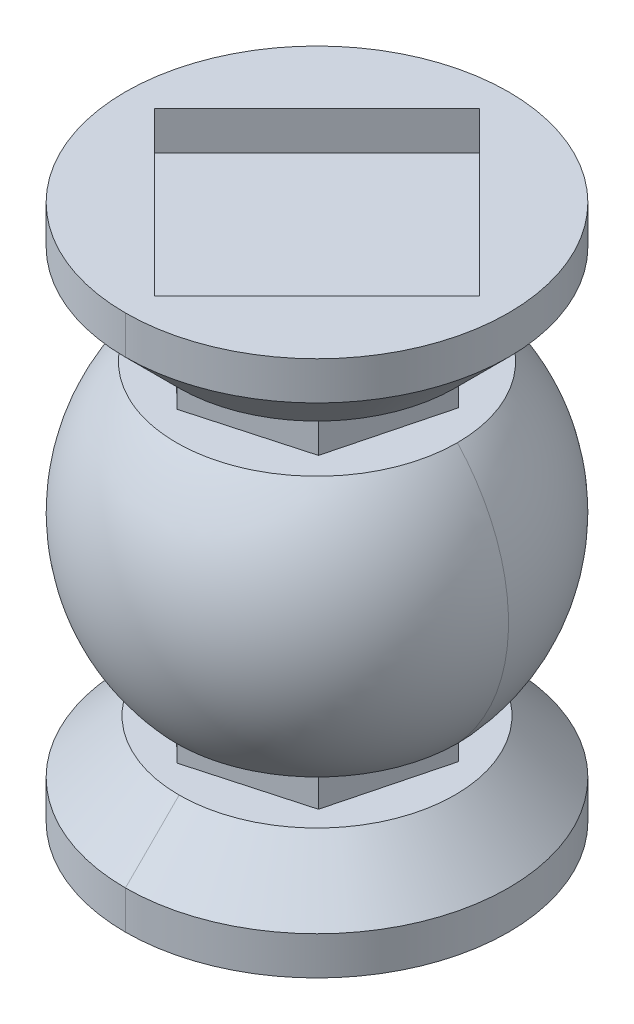
ISO-10303-21;
HEADER;
FILE_DESCRIPTION(('STEP AP214'),'2;1');
FILE_NAME('part.step','',(''),(''),'','','');
FILE_SCHEMA(('AUTOMOTIVE_DESIGN { 1 0 10303 214 1 1 1 1 }'));
ENDSEC;
DATA;
#1=APPLICATION_CONTEXT('core data for automotive mechanical design processes');
#2=APPLICATION_PROTOCOL_DEFINITION('international standard','automotive_design',2000,#1);
#3=PRODUCT_CONTEXT('',#1,'mechanical');
#4=PRODUCT('Part','Part','',(#3));
#5=PRODUCT_RELATED_PRODUCT_CATEGORY('part','',(#4));
#6=PRODUCT_DEFINITION_FORMATION('','',#4);
#7=PRODUCT_DEFINITION_CONTEXT('part definition',#1,'design');
#8=PRODUCT_DEFINITION('design','',#6,#7);
#9=PRODUCT_DEFINITION_SHAPE('','',#8);
#10=(LENGTH_UNIT() NAMED_UNIT(*) SI_UNIT(.MILLI.,.METRE.));
#11=(NAMED_UNIT(*) PLANE_ANGLE_UNIT() SI_UNIT($,.RADIAN.));
#12=(NAMED_UNIT(*) SI_UNIT($,.STERADIAN.) SOLID_ANGLE_UNIT());
#13=UNCERTAINTY_MEASURE_WITH_UNIT(LENGTH_MEASURE(1.E-05),#10,'distance_accuracy_value','');
#14=(GEOMETRIC_REPRESENTATION_CONTEXT(3) GLOBAL_UNCERTAINTY_ASSIGNED_CONTEXT((#13)) GLOBAL_UNIT_ASSIGNED_CONTEXT((#10,
#11,#12)) REPRESENTATION_CONTEXT('',''));
#15=CARTESIAN_POINT('',(0.,0.,0.));
#16=DIRECTION('',(0.,0.,1.));
#17=DIRECTION('',(1.,0.,0.));
#18=AXIS2_PLACEMENT_3D('',#15,#16,#17);
#19=CARTESIAN_POINT('',(0.,-30.,0.));
#20=DIRECTION('',(0.,1.,0.));
#21=DIRECTION('',(1.,0.,0.));
#22=AXIS2_PLACEMENT_3D('',#19,#20,#21);
#23=PLANE('',#22);
#24=DIRECTION('',(0.707106781186548,0.,-0.707106781186548));
#25=VECTOR('',#24,1.);
#26=CARTESIAN_POINT('',(21.2132034355966,-30.,0.));
#27=LINE('',#26,#25);
#28=CARTESIAN_POINT('',(0.,-30.,21.2132034355966));
#29=VERTEX_POINT('',#28);
#30=CARTESIAN_POINT('',(21.2132034355966,-30.,0.));
#31=VERTEX_POINT('',#30);
#32=EDGE_CURVE('E362',#29,#31,#27,.T.);
#33=ORIENTED_EDGE('',*,*,#32,.F.);
#34=DIRECTION('',(0.707106781186547,0.,0.707106781186548));
#35=VECTOR('',#34,1.);
#36=CARTESIAN_POINT('',(-21.2132034355966,-30.,0.));
#37=LINE('',#36,#35);
#38=CARTESIAN_POINT('',(-21.2132034355966,-30.,0.));
#39=VERTEX_POINT('',#38);
#40=EDGE_CURVE('E11',#39,#29,#37,.T.);
#41=ORIENTED_EDGE('',*,*,#40,.F.);
#42=DIRECTION('',(-0.707106781186548,0.,0.707106781186548));
#43=VECTOR('',#42,1.);
#44=CARTESIAN_POINT('',(0.,-30.,-21.2132034355966));
#45=LINE('',#44,#43);
#46=CARTESIAN_POINT('',(0.,-30.,-21.2132034355966));
#47=VERTEX_POINT('',#46);
#48=EDGE_CURVE('E43',#47,#39,#45,.T.);
#49=ORIENTED_EDGE('',*,*,#48,.F.);
#50=DIRECTION('',(-0.707106781186547,0.,-0.707106781186548));
#51=VECTOR('',#50,1.);
#52=CARTESIAN_POINT('',(0.,-30.,-21.2132034355966));
#53=LINE('',#52,#51);
#54=EDGE_CURVE('E378',#31,#47,#53,.T.);
#55=ORIENTED_EDGE('',*,*,#54,.F.);
#56=EDGE_LOOP('',(#33,#41,#49,#55));
#57=FACE_BOUND('',#56,.T.);
#58=ADVANCED_FACE('F16',(#57),#23,.F.);
#59=CARTESIAN_POINT('',(-21.2132034355966,-30.,0.));
#60=DIRECTION('',(0.707106781186548,0.,-0.707106781186547));
#61=DIRECTION('',(0.,-1.,0.));
#62=AXIS2_PLACEMENT_3D('',#59,#60,#61);
#63=PLANE('',#62);
#64=DIRECTION('',(0.707106781186547,0.,0.707106781186548));
#65=VECTOR('',#64,1.);
#66=CARTESIAN_POINT('',(-21.2132034355966,-35.,0.));
#67=LINE('',#66,#65);
#68=CARTESIAN_POINT('',(-21.2132034355966,-35.,0.));
#69=VERTEX_POINT('',#68);
#70=CARTESIAN_POINT('',(0.,-35.,21.2132034355966));
#71=VERTEX_POINT('',#70);
#72=EDGE_CURVE('E416',#69,#71,#67,.T.);
#73=ORIENTED_EDGE('',*,*,#72,.F.);
#74=DIRECTION('',(0.,-1.,0.));
#75=VECTOR('',#74,1.);
#76=CARTESIAN_POINT('',(-21.2132034355966,-30.,0.));
#77=LINE('',#76,#75);
#78=EDGE_CURVE('E24',#39,#69,#77,.T.);
#79=ORIENTED_EDGE('',*,*,#78,.F.);
#80=ORIENTED_EDGE('',*,*,#40,.T.);
#81=DIRECTION('',(0.,-1.,0.));
#82=VECTOR('',#81,1.);
#83=CARTESIAN_POINT('',(0.,-30.,21.2132034355966));
#84=LINE('',#83,#82);
#85=EDGE_CURVE('E330',#29,#71,#84,.T.);
#86=ORIENTED_EDGE('',*,*,#85,.T.);
#87=EDGE_LOOP('',(#73,#79,#80,#86));
#88=FACE_BOUND('',#87,.T.);
#89=ADVANCED_FACE('F637',(#88),#63,.T.);
#90=CARTESIAN_POINT('',(0.,-30.,-21.2132034355966));
#91=DIRECTION('',(0.707106781186548,0.,0.707106781186548));
#92=DIRECTION('',(0.,-1.,0.));
#93=AXIS2_PLACEMENT_3D('',#90,#91,#92);
#94=PLANE('',#93);
#95=DIRECTION('',(-0.707106781186548,0.,0.707106781186548));
#96=VECTOR('',#95,1.);
#97=CARTESIAN_POINT('',(0.,-35.,-21.2132034355966));
#98=LINE('',#97,#96);
#99=CARTESIAN_POINT('',(0.,-35.,-21.2132034355966));
#100=VERTEX_POINT('',#99);
#101=EDGE_CURVE('E501',#100,#69,#98,.T.);
#102=ORIENTED_EDGE('',*,*,#101,.F.);
#103=DIRECTION('',(0.,-1.,0.));
#104=VECTOR('',#103,1.);
#105=CARTESIAN_POINT('',(0.,-30.,-21.2132034355966));
#106=LINE('',#105,#104);
#107=EDGE_CURVE('E373',#47,#100,#106,.T.);
#108=ORIENTED_EDGE('',*,*,#107,.F.);
#109=ORIENTED_EDGE('',*,*,#48,.T.);
#110=ORIENTED_EDGE('',*,*,#78,.T.);
#111=EDGE_LOOP('',(#102,#108,#109,#110));
#112=FACE_BOUND('',#111,.T.);
#113=ADVANCED_FACE('F641',(#112),#94,.T.);
#114=CARTESIAN_POINT('',(0.,-30.,-21.2132034355966));
#115=DIRECTION('',(-0.707106781186548,0.,0.707106781186547));
#116=DIRECTION('',(0.,1.,0.));
#117=AXIS2_PLACEMENT_3D('',#114,#115,#116);
#118=PLANE('',#117);
#119=DIRECTION('',(-0.707106781186547,0.,-0.707106781186548));
#120=VECTOR('',#119,1.);
#121=CARTESIAN_POINT('',(0.,-35.,-21.2132034355966));
#122=LINE('',#121,#120);
#123=CARTESIAN_POINT('',(21.2132034355966,-35.,0.));
#124=VERTEX_POINT('',#123);
#125=EDGE_CURVE('E497',#124,#100,#122,.T.);
#126=ORIENTED_EDGE('',*,*,#125,.F.);
#127=DIRECTION('',(0.,-1.,0.));
#128=VECTOR('',#127,1.);
#129=CARTESIAN_POINT('',(21.2132034355966,-30.,0.));
#130=LINE('',#129,#128);
#131=EDGE_CURVE('E365',#31,#124,#130,.T.);
#132=ORIENTED_EDGE('',*,*,#131,.F.);
#133=ORIENTED_EDGE('',*,*,#54,.T.);
#134=ORIENTED_EDGE('',*,*,#107,.T.);
#135=EDGE_LOOP('',(#126,#132,#133,#134));
#136=FACE_BOUND('',#135,.T.);
#137=ADVANCED_FACE('F649',(#136),#118,.T.);
#138=CARTESIAN_POINT('',(21.2132034355966,-30.,0.));
#139=DIRECTION('',(-0.707106781186548,0.,-0.707106781186548));
#140=DIRECTION('',(-0.707106781186548,0.,0.707106781186548));
#141=AXIS2_PLACEMENT_3D('',#138,#139,#140);
#142=PLANE('',#141);
#143=DIRECTION('',(0.707106781186548,0.,-0.707106781186548));
#144=VECTOR('',#143,1.);
#145=CARTESIAN_POINT('',(21.2132034355966,-35.,0.));
#146=LINE('',#145,#144);
#147=EDGE_CURVE('E420',#71,#124,#146,.T.);
#148=ORIENTED_EDGE('',*,*,#147,.F.);
#149=ORIENTED_EDGE('',*,*,#85,.F.);
#150=ORIENTED_EDGE('',*,*,#32,.T.);
#151=ORIENTED_EDGE('',*,*,#131,.T.);
#152=EDGE_LOOP('',(#148,#149,#150,#151));
#153=FACE_BOUND('',#152,.T.);
#154=ADVANCED_FACE('F644',(#153),#142,.T.);
#155=CARTESIAN_POINT('',(0.,30.,0.));
#156=DIRECTION('',(0.,1.,0.));
#157=DIRECTION('',(1.,0.,0.));
#158=AXIS2_PLACEMENT_3D('',#155,#156,#157);
#159=PLANE('',#158);
#160=DIRECTION('',(0.707106781186548,0.,-0.707106781186548));
#161=VECTOR('',#160,1.);
#162=CARTESIAN_POINT('',(21.2132034355966,30.,0.));
#163=LINE('',#162,#161);
#164=CARTESIAN_POINT('',(0.,30.,21.2132034355966));
#165=VERTEX_POINT('',#164);
#166=CARTESIAN_POINT('',(21.2132034355966,30.,0.));
#167=VERTEX_POINT('',#166);
#168=EDGE_CURVE('E310',#165,#167,#163,.T.);
#169=ORIENTED_EDGE('',*,*,#168,.T.);
#170=DIRECTION('',(-0.707106781186547,0.,-0.707106781186548));
#171=VECTOR('',#170,1.);
#172=CARTESIAN_POINT('',(0.,30.,-21.2132034355966));
#173=LINE('',#172,#171);
#174=CARTESIAN_POINT('',(0.,30.,-21.2132034355966));
#175=VERTEX_POINT('',#174);
#176=EDGE_CURVE('E327',#167,#175,#173,.T.);
#177=ORIENTED_EDGE('',*,*,#176,.T.);
#178=DIRECTION('',(-0.707106781186548,0.,0.707106781186548));
#179=VECTOR('',#178,1.);
#180=CARTESIAN_POINT('',(0.,30.,-21.2132034355966));
#181=LINE('',#180,#179);
#182=CARTESIAN_POINT('',(-21.2132034355966,30.,0.));
#183=VERTEX_POINT('',#182);
#184=EDGE_CURVE('E357',#175,#183,#181,.T.);
#185=ORIENTED_EDGE('',*,*,#184,.T.);
#186=DIRECTION('',(0.707106781186547,0.,0.707106781186548));
#187=VECTOR('',#186,1.);
#188=CARTESIAN_POINT('',(-21.2132034355966,30.,0.));
#189=LINE('',#188,#187);
#190=EDGE_CURVE('E353',#183,#165,#189,.T.);
#191=ORIENTED_EDGE('',*,*,#190,.T.);
#192=EDGE_LOOP('',(#169,#177,#185,#191));
#193=FACE_BOUND('',#192,.T.);
#194=ADVANCED_FACE('F656',(#193),#159,.T.);
#195=CARTESIAN_POINT('',(0.,30.,-21.2132034355966));
#196=DIRECTION('',(0.707106781186548,0.,-0.707106781186547));
#197=DIRECTION('',(0.,-1.,0.));
#198=AXIS2_PLACEMENT_3D('',#195,#196,#197);
#199=PLANE('',#198);
#200=DIRECTION('',(-0.707106781186547,0.,-0.707106781186548));
#201=VECTOR('',#200,1.);
#202=CARTESIAN_POINT('',(0.,35.,-21.2132034355966));
#203=LINE('',#202,#201);
#204=CARTESIAN_POINT('',(21.2132034355966,35.,0.));
#205=VERTEX_POINT('',#204);
#206=CARTESIAN_POINT('',(0.,35.,-21.2132034355966));
#207=VERTEX_POINT('',#206);
#208=EDGE_CURVE('E524',#205,#207,#203,.T.);
#209=ORIENTED_EDGE('',*,*,#208,.T.);
#210=DIRECTION('',(0.,1.,0.));
#211=VECTOR('',#210,1.);
#212=CARTESIAN_POINT('',(0.,30.,-21.2132034355966));
#213=LINE('',#212,#211);
#214=EDGE_CURVE('E331',#175,#207,#213,.T.);
#215=ORIENTED_EDGE('',*,*,#214,.F.);
#216=ORIENTED_EDGE('',*,*,#176,.F.);
#217=DIRECTION('',(0.,1.,0.));
#218=VECTOR('',#217,1.);
#219=CARTESIAN_POINT('',(21.2132034355966,30.,0.));
#220=LINE('',#219,#218);
#221=EDGE_CURVE('E307',#167,#205,#220,.T.);
#222=ORIENTED_EDGE('',*,*,#221,.T.);
#223=EDGE_LOOP('',(#209,#215,#216,#222));
#224=FACE_BOUND('',#223,.T.);
#225=ADVANCED_FACE('F699',(#224),#199,.F.);
#226=CARTESIAN_POINT('',(0.,30.,-21.2132034355966));
#227=DIRECTION('',(-0.707106781186548,0.,-0.707106781186548));
#228=DIRECTION('',(-0.707106781186548,0.,0.707106781186548));
#229=AXIS2_PLACEMENT_3D('',#226,#227,#228);
#230=PLANE('',#229);
#231=DIRECTION('',(-0.707106781186548,0.,0.707106781186548));
#232=VECTOR('',#231,1.);
#233=CARTESIAN_POINT('',(0.,35.,-21.2132034355966));
#234=LINE('',#233,#232);
#235=CARTESIAN_POINT('',(-21.2132034355966,35.,0.));
#236=VERTEX_POINT('',#235);
#237=EDGE_CURVE('E386',#207,#236,#234,.T.);
#238=ORIENTED_EDGE('',*,*,#237,.T.);
#239=DIRECTION('',(0.,1.,0.));
#240=VECTOR('',#239,1.);
#241=CARTESIAN_POINT('',(-21.2132034355966,30.,0.));
#242=LINE('',#241,#240);
#243=EDGE_CURVE('E356',#183,#236,#242,.T.);
#244=ORIENTED_EDGE('',*,*,#243,.F.);
#245=ORIENTED_EDGE('',*,*,#184,.F.);
#246=ORIENTED_EDGE('',*,*,#214,.T.);
#247=EDGE_LOOP('',(#238,#244,#245,#246));
#248=FACE_BOUND('',#247,.T.);
#249=ADVANCED_FACE('F695',(#248),#230,.F.);
#250=CARTESIAN_POINT('',(-21.2132034355966,30.,0.));
#251=DIRECTION('',(-0.707106781186548,0.,0.707106781186547));
#252=DIRECTION('',(0.,1.,0.));
#253=AXIS2_PLACEMENT_3D('',#250,#251,#252);
#254=PLANE('',#253);
#255=DIRECTION('',(0.707106781186547,0.,0.707106781186548));
#256=VECTOR('',#255,1.);
#257=CARTESIAN_POINT('',(-21.2132034355966,35.,0.));
#258=LINE('',#257,#256);
#259=CARTESIAN_POINT('',(0.,35.,21.2132034355966));
#260=VERTEX_POINT('',#259);
#261=EDGE_CURVE('E382',#236,#260,#258,.T.);
#262=ORIENTED_EDGE('',*,*,#261,.T.);
#263=DIRECTION('',(0.,1.,0.));
#264=VECTOR('',#263,1.);
#265=CARTESIAN_POINT('',(0.,30.,21.2132034355966));
#266=LINE('',#265,#264);
#267=EDGE_CURVE('E352',#165,#260,#266,.T.);
#268=ORIENTED_EDGE('',*,*,#267,.F.);
#269=ORIENTED_EDGE('',*,*,#190,.F.);
#270=ORIENTED_EDGE('',*,*,#243,.T.);
#271=EDGE_LOOP('',(#262,#268,#269,#270));
#272=FACE_BOUND('',#271,.T.);
#273=ADVANCED_FACE('F691',(#272),#254,.F.);
#274=CARTESIAN_POINT('',(21.2132034355966,30.,0.));
#275=DIRECTION('',(0.707106781186548,0.,0.707106781186548));
#276=DIRECTION('',(0.,-1.,0.));
#277=AXIS2_PLACEMENT_3D('',#274,#275,#276);
#278=PLANE('',#277);
#279=DIRECTION('',(0.707106781186548,0.,-0.707106781186548));
#280=VECTOR('',#279,1.);
#281=CARTESIAN_POINT('',(21.2132034355966,35.,0.));
#282=LINE('',#281,#280);
#283=EDGE_CURVE('E520',#260,#205,#282,.T.);
#284=ORIENTED_EDGE('',*,*,#283,.T.);
#285=ORIENTED_EDGE('',*,*,#221,.F.);
#286=ORIENTED_EDGE('',*,*,#168,.F.);
#287=ORIENTED_EDGE('',*,*,#267,.T.);
#288=EDGE_LOOP('',(#284,#285,#286,#287));
#289=FACE_BOUND('',#288,.T.);
#290=ADVANCED_FACE('F687',(#289),#278,.F.);
#291=CARTESIAN_POINT('',(0.,-20.,0.));
#292=DIRECTION('',(0.,-1.,0.));
#293=DIRECTION('',(0.,0.,-1.));
#294=AXIS2_PLACEMENT_3D('',#291,#292,#293);
#295=CONICAL_SURFACE('',#294,15.,0.785515656036115);
#296=DIRECTION('',(0.,-0.707023696464563,0.707189856147262));
#297=VECTOR('',#296,1.);
#298=CARTESIAN_POINT('',(0.,-20.,15.));
#299=LINE('',#298,#297);
#300=CARTESIAN_POINT('',(0.,-23.,18.0007050386721));
#301=VERTEX_POINT('',#300);
#302=CARTESIAN_POINT('',(0.,-30.,25.0023501289071));
#303=VERTEX_POINT('',#302);
#304=EDGE_CURVE('E415',#301,#303,#299,.T.);
#305=ORIENTED_EDGE('',*,*,#304,.F.);
#306=CARTESIAN_POINT('',(0.,-23.,0.));
#307=DIRECTION('',(0.,-1.,0.));
#308=DIRECTION('',(0.,0.,1.));
#309=AXIS2_PLACEMENT_3D('',#306,#307,#308);
#310=CIRCLE('',#309,18.0007050386721);
#311=CARTESIAN_POINT('',(0.,-23.,-18.0007050386721));
#312=VERTEX_POINT('',#311);
#313=EDGE_CURVE('E298',#301,#312,#310,.T.);
#314=ORIENTED_EDGE('',*,*,#313,.T.);
#315=DIRECTION('',(0.,-0.707023696464563,-0.707189856147262));
#316=VECTOR('',#315,1.);
#317=CARTESIAN_POINT('',(0.,-20.,-15.));
#318=LINE('',#317,#316);
#319=CARTESIAN_POINT('',(0.,-30.,-25.0023501289071));
#320=VERTEX_POINT('',#319);
#321=EDGE_CURVE('E414',#312,#320,#318,.T.);
#322=ORIENTED_EDGE('',*,*,#321,.T.);
#323=CARTESIAN_POINT('',(0.,-30.,0.));
#324=DIRECTION('',(0.,1.,0.));
#325=DIRECTION('',(0.,0.,1.));
#326=AXIS2_PLACEMENT_3D('',#323,#324,#325);
#327=CIRCLE('',#326,25.0023501289071);
#328=EDGE_CURVE('E311',#320,#303,#327,.T.);
#329=ORIENTED_EDGE('',*,*,#328,.T.);
#330=EDGE_LOOP('',(#305,#314,#322,#329));
#331=FACE_BOUND('',#330,.T.);
#332=ADVANCED_FACE('F684',(#331),#295,.T.);
#333=CARTESIAN_POINT('',(0.,67.707423580786,0.));
#334=DIRECTION('',(0.,1.,0.));
#335=DIRECTION('',(0.,0.,1.));
#336=AXIS2_PLACEMENT_3D('',#333,#334,#335);
#337=CYLINDRICAL_SURFACE('',#336,25.0023501289071);
#338=DIRECTION('',(0.,1.,0.));
#339=VECTOR('',#338,1.);
#340=CARTESIAN_POINT('',(0.,67.707423580786,-25.0023501289071));
#341=LINE('',#340,#339);
#342=CARTESIAN_POINT('',(0.,-35.,-25.002350128907));
#343=VERTEX_POINT('',#342);
#344=EDGE_CURVE('E431',#343,#320,#341,.T.);
#345=ORIENTED_EDGE('',*,*,#344,.F.);
#346=CARTESIAN_POINT('',(0.,-35.,0.));
#347=DIRECTION('',(0.,1.,0.));
#348=DIRECTION('',(0.,0.,1.));
#349=AXIS2_PLACEMENT_3D('',#346,#347,#348);
#350=CIRCLE('',#349,25.002350128907);
#351=CARTESIAN_POINT('',(0.,-35.,25.002350128907));
#352=VERTEX_POINT('',#351);
#353=EDGE_CURVE('E421',#343,#352,#350,.T.);
#354=ORIENTED_EDGE('',*,*,#353,.T.);
#355=DIRECTION('',(0.,1.,0.));
#356=VECTOR('',#355,1.);
#357=CARTESIAN_POINT('',(0.,67.707423580786,25.0023501289071));
#358=LINE('',#357,#356);
#359=EDGE_CURVE('E435',#352,#303,#358,.T.);
#360=ORIENTED_EDGE('',*,*,#359,.T.);
#361=ORIENTED_EDGE('',*,*,#328,.F.);
#362=EDGE_LOOP('',(#345,#354,#360,#361));
#363=FACE_BOUND('',#362,.T.);
#364=ADVANCED_FACE('F683',(#363),#337,.T.);
#365=CARTESIAN_POINT('',(10.7017224091414,-23.,10.5106202232637));
#366=DIRECTION('',(0.968218238813169,0.,0.250106861220409));
#367=DIRECTION('',(0.,-1.,0.));
#368=AXIS2_PLACEMENT_3D('',#365,#366,#367);
#369=PLANE('',#368);
#370=DIRECTION('',(0.250106861220409,0.,-0.968218238813169));
#371=VECTOR('',#370,1.);
#372=CARTESIAN_POINT('',(10.7017224091414,-17.,10.5106202232637));
#373=LINE('',#372,#371);
#374=CARTESIAN_POINT('',(10.7017224091414,-17.,10.5106202232637));
#375=VERTEX_POINT('',#374);
#376=CARTESIAN_POINT('',(14.4533253274476,-17.,-4.01265335893382));
#377=VERTEX_POINT('',#376);
#378=EDGE_CURVE('E319',#375,#377,#373,.T.);
#379=ORIENTED_EDGE('',*,*,#378,.F.);
#380=DIRECTION('',(0.,1.,0.));
#381=VECTOR('',#380,1.);
#382=CARTESIAN_POINT('',(10.7017224091414,-23.,10.5106202232637));
#383=LINE('',#382,#381);
#384=CARTESIAN_POINT('',(10.7017224091414,-23.,10.5106202232637));
#385=VERTEX_POINT('',#384);
#386=EDGE_CURVE('E339',#385,#375,#383,.T.);
#387=ORIENTED_EDGE('',*,*,#386,.F.);
#388=DIRECTION('',(0.250106861220409,0.,-0.968218238813169));
#389=VECTOR('',#388,1.);
#390=CARTESIAN_POINT('',(10.7017224091414,-23.,10.5106202232637));
#391=LINE('',#390,#389);
#392=CARTESIAN_POINT('',(14.4533253274476,-23.,-4.01265335893382));
#393=VERTEX_POINT('',#392);
#394=EDGE_CURVE('E302',#385,#393,#391,.T.);
#395=ORIENTED_EDGE('',*,*,#394,.T.);
#396=DIRECTION('',(0.,1.,0.));
#397=VECTOR('',#396,1.);
#398=CARTESIAN_POINT('',(14.4533253274476,-23.,-4.01265335893382));
#399=LINE('',#398,#397);
#400=EDGE_CURVE('E342',#393,#377,#399,.T.);
#401=ORIENTED_EDGE('',*,*,#400,.T.);
#402=EDGE_LOOP('',(#379,#387,#395,#401));
#403=FACE_BOUND('',#402,.T.);
#404=ADVANCED_FACE('F597',(#403),#369,.T.);
#405=CARTESIAN_POINT('',(14.4533253274476,-23.,-4.01265335893382));
#406=DIRECTION('',(0.700708014884248,0.,-0.713448160609428));
#407=DIRECTION('',(0.,-1.,0.));
#408=AXIS2_PLACEMENT_3D('',#405,#406,#407);
#409=PLANE('',#408);
#410=DIRECTION('',(-0.713448160609428,0.,-0.700708014884248));
#411=VECTOR('',#410,1.);
#412=CARTESIAN_POINT('',(14.4533253274476,-17.,-4.01265335893382));
#413=LINE('',#412,#411);
#414=CARTESIAN_POINT('',(3.75160291830613,-17.,-14.5232735821975));
#415=VERTEX_POINT('',#414);
#416=EDGE_CURVE('E320',#377,#415,#413,.T.);
#417=ORIENTED_EDGE('',*,*,#416,.F.);
#418=ORIENTED_EDGE('',*,*,#400,.F.);
#419=DIRECTION('',(-0.713448160609428,0.,-0.700708014884248));
#420=VECTOR('',#419,1.);
#421=CARTESIAN_POINT('',(14.4533253274476,-23.,-4.01265335893382));
#422=LINE('',#421,#420);
#423=CARTESIAN_POINT('',(3.75160291830613,-23.,-14.5232735821975));
#424=VERTEX_POINT('',#423);
#425=EDGE_CURVE('E285',#393,#424,#422,.T.);
#426=ORIENTED_EDGE('',*,*,#425,.T.);
#427=DIRECTION('',(0.,1.,0.));
#428=VECTOR('',#427,1.);
#429=CARTESIAN_POINT('',(3.75160291830613,-23.,-14.5232735821975));
#430=LINE('',#429,#428);
#431=EDGE_CURVE('E275',#424,#415,#430,.T.);
#432=ORIENTED_EDGE('',*,*,#431,.T.);
#433=EDGE_LOOP('',(#417,#418,#426,#432));
#434=FACE_BOUND('',#433,.T.);
#435=ADVANCED_FACE('F593',(#434),#409,.T.);
#436=CARTESIAN_POINT('',(3.75160291830613,-23.,-14.5232735821975));
#437=DIRECTION('',(-0.267510223928921,0.,-0.963555021829837));
#438=DIRECTION('',(-0.963555021829837,0.,0.267510223928921));
#439=AXIS2_PLACEMENT_3D('',#436,#437,#438);
#440=PLANE('',#439);
#441=DIRECTION('',(-0.963555021829837,0.,0.267510223928921));
#442=VECTOR('',#441,1.);
#443=CARTESIAN_POINT('',(3.75160291830613,-17.,-14.5232735821975));
#444=LINE('',#443,#442);
#445=CARTESIAN_POINT('',(-10.7017224091414,-17.,-10.5106202232637));
#446=VERTEX_POINT('',#445);
#447=EDGE_CURVE('E324',#415,#446,#444,.T.);
#448=ORIENTED_EDGE('',*,*,#447,.F.);
#449=ORIENTED_EDGE('',*,*,#431,.F.);
#450=DIRECTION('',(-0.963555021829837,0.,0.267510223928921));
#451=VECTOR('',#450,1.);
#452=CARTESIAN_POINT('',(3.75160291830613,-23.,-14.5232735821975));
#453=LINE('',#452,#451);
#454=CARTESIAN_POINT('',(-10.7017224091414,-23.,-10.5106202232637));
#455=VERTEX_POINT('',#454);
#456=EDGE_CURVE('E279',#424,#455,#453,.T.);
#457=ORIENTED_EDGE('',*,*,#456,.T.);
#458=DIRECTION('',(0.,1.,0.));
#459=VECTOR('',#458,1.);
#460=CARTESIAN_POINT('',(-10.7017224091414,-23.,-10.5106202232637));
#461=LINE('',#460,#459);
#462=EDGE_CURVE('E263',#455,#446,#461,.T.);
#463=ORIENTED_EDGE('',*,*,#462,.T.);
#464=EDGE_LOOP('',(#448,#449,#457,#463));
#465=FACE_BOUND('',#464,.T.);
#466=ADVANCED_FACE('F280',(#465),#440,.T.);
#467=CARTESIAN_POINT('',(-10.7017224091414,-23.,-10.5106202232637));
#468=DIRECTION('',(-0.968218238813169,0.,-0.250106861220409));
#469=DIRECTION('',(-0.250106861220409,0.,0.968218238813169));
#470=AXIS2_PLACEMENT_3D('',#467,#468,#469);
#471=PLANE('',#470);
#472=DIRECTION('',(-0.250106861220409,0.,0.968218238813169));
#473=VECTOR('',#472,1.);
#474=CARTESIAN_POINT('',(-10.7017224091414,-17.,-10.5106202232637));
#475=LINE('',#474,#473);
#476=CARTESIAN_POINT('',(-14.4533253274476,-17.,4.01265335893382));
#477=VERTEX_POINT('',#476);
#478=EDGE_CURVE('E270',#446,#477,#475,.T.);
#479=ORIENTED_EDGE('',*,*,#478,.F.);
#480=ORIENTED_EDGE('',*,*,#462,.F.);
#481=DIRECTION('',(-0.250106861220409,0.,0.968218238813169));
#482=VECTOR('',#481,1.);
#483=CARTESIAN_POINT('',(-10.7017224091414,-23.,-10.5106202232637));
#484=LINE('',#483,#482);
#485=CARTESIAN_POINT('',(-14.4533253274476,-23.,4.01265335893382));
#486=VERTEX_POINT('',#485);
#487=EDGE_CURVE('E267',#455,#486,#484,.T.);
#488=ORIENTED_EDGE('',*,*,#487,.T.);
#489=DIRECTION('',(0.,1.,0.));
#490=VECTOR('',#489,1.);
#491=CARTESIAN_POINT('',(-14.4533253274476,-23.,4.01265335893382));
#492=LINE('',#491,#490);
#493=EDGE_CURVE('E276',#486,#477,#492,.T.);
#494=ORIENTED_EDGE('',*,*,#493,.T.);
#495=EDGE_LOOP('',(#479,#480,#488,#494));
#496=FACE_BOUND('',#495,.T.);
#497=ADVANCED_FACE('F265',(#496),#471,.T.);
#498=CARTESIAN_POINT('',(-14.4533253274476,-23.,4.01265335893382));
#499=DIRECTION('',(-0.700708014884248,0.,0.713448160609428));
#500=DIRECTION('',(0.,1.,0.));
#501=AXIS2_PLACEMENT_3D('',#498,#499,#500);
#502=PLANE('',#501);
#503=DIRECTION('',(0.713448160609428,0.,0.700708014884248));
#504=VECTOR('',#503,1.);
#505=CARTESIAN_POINT('',(-14.4533253274476,-17.,4.01265335893382));
#506=LINE('',#505,#504);
#507=CARTESIAN_POINT('',(-3.75160291830614,-17.,14.5232735821975));
#508=VERTEX_POINT('',#507);
#509=EDGE_CURVE('E332',#477,#508,#506,.T.);
#510=ORIENTED_EDGE('',*,*,#509,.F.);
#511=ORIENTED_EDGE('',*,*,#493,.F.);
#512=DIRECTION('',(0.713448160609428,0.,0.700708014884248));
#513=VECTOR('',#512,1.);
#514=CARTESIAN_POINT('',(-14.4533253274476,-23.,4.01265335893382));
#515=LINE('',#514,#513);
#516=CARTESIAN_POINT('',(-3.75160291830614,-23.,14.5232735821975));
#517=VERTEX_POINT('',#516);
#518=EDGE_CURVE('E291',#486,#517,#515,.T.);
#519=ORIENTED_EDGE('',*,*,#518,.T.);
#520=DIRECTION('',(0.,1.,0.));
#521=VECTOR('',#520,1.);
#522=CARTESIAN_POINT('',(-3.75160291830614,-23.,14.5232735821975));
#523=LINE('',#522,#521);
#524=EDGE_CURVE('E336',#517,#508,#523,.T.);
#525=ORIENTED_EDGE('',*,*,#524,.T.);
#526=EDGE_LOOP('',(#510,#511,#519,#525));
#527=FACE_BOUND('',#526,.T.);
#528=ADVANCED_FACE('F603',(#527),#502,.T.);
#529=CARTESIAN_POINT('',(-3.75160291830614,-23.,14.5232735821975));
#530=DIRECTION('',(0.267510223928921,0.,0.963555021829837));
#531=DIRECTION('',(0.,-1.,0.));
#532=AXIS2_PLACEMENT_3D('',#529,#530,#531);
#533=PLANE('',#532);
#534=DIRECTION('',(0.963555021829837,0.,-0.267510223928921));
#535=VECTOR('',#534,1.);
#536=CARTESIAN_POINT('',(-3.75160291830614,-17.,14.5232735821975));
#537=LINE('',#536,#535);
#538=EDGE_CURVE('E315',#508,#375,#537,.T.);
#539=ORIENTED_EDGE('',*,*,#538,.F.);
#540=ORIENTED_EDGE('',*,*,#524,.F.);
#541=DIRECTION('',(0.963555021829837,0.,-0.267510223928921));
#542=VECTOR('',#541,1.);
#543=CARTESIAN_POINT('',(-3.75160291830614,-23.,14.5232735821975));
#544=LINE('',#543,#542);
#545=EDGE_CURVE('E306',#517,#385,#544,.T.);
#546=ORIENTED_EDGE('',*,*,#545,.T.);
#547=ORIENTED_EDGE('',*,*,#386,.T.);
#548=EDGE_LOOP('',(#539,#540,#546,#547));
#549=FACE_BOUND('',#548,.T.);
#550=ADVANCED_FACE('F600',(#549),#533,.T.);
#551=CARTESIAN_POINT('',(0.,-17.,0.));
#552=DIRECTION('',(0.,1.,0.));
#553=DIRECTION('',(1.,0.,0.));
#554=AXIS2_PLACEMENT_3D('',#551,#552,#553);
#555=PLANE('',#554);
#556=ORIENTED_EDGE('',*,*,#538,.T.);
#557=ORIENTED_EDGE('',*,*,#378,.T.);
#558=ORIENTED_EDGE('',*,*,#416,.T.);
#559=ORIENTED_EDGE('',*,*,#447,.T.);
#560=ORIENTED_EDGE('',*,*,#478,.T.);
#561=ORIENTED_EDGE('',*,*,#509,.T.);
#562=EDGE_LOOP('',(#556,#557,#558,#559,#560,#561));
#563=FACE_BOUND('',#562,.T.);
#564=CARTESIAN_POINT('',(0.,-17.,0.));
#565=DIRECTION('',(0.,-1.,0.));
#566=DIRECTION('',(0.,0.,1.));
#567=AXIS2_PLACEMENT_3D('',#564,#565,#566);
#568=CIRCLE('',#567,18.3303027798234);
#569=CARTESIAN_POINT('',(-18.3303027798234,-17.,0.));
#570=VERTEX_POINT('',#569);
#571=CARTESIAN_POINT('',(18.3303027798234,-17.,0.));
#572=VERTEX_POINT('',#571);
#573=EDGE_CURVE('E506',#570,#572,#568,.T.);
#574=ORIENTED_EDGE('',*,*,#573,.T.);
#575=CARTESIAN_POINT('',(0.,-17.,0.));
#576=DIRECTION('',(0.,-1.,0.));
#577=DIRECTION('',(0.,0.,1.));
#578=AXIS2_PLACEMENT_3D('',#575,#576,#577);
#579=CIRCLE('',#578,18.3303027798234);
#580=EDGE_CURVE('E470',#572,#570,#579,.T.);
#581=ORIENTED_EDGE('',*,*,#580,.T.);
#582=EDGE_LOOP('',(#574,#581));
#583=FACE_BOUND('',#582,.T.);
#584=ADVANCED_FACE('F605',(#563,#583),#555,.F.);
#585=CARTESIAN_POINT('',(0.,-23.,0.));
#586=DIRECTION('',(0.,1.,0.));
#587=DIRECTION('',(1.,0.,0.));
#588=AXIS2_PLACEMENT_3D('',#585,#586,#587);
#589=PLANE('',#588);
#590=ORIENTED_EDGE('',*,*,#518,.F.);
#591=ORIENTED_EDGE('',*,*,#487,.F.);
#592=ORIENTED_EDGE('',*,*,#456,.F.);
#593=ORIENTED_EDGE('',*,*,#425,.F.);
#594=ORIENTED_EDGE('',*,*,#394,.F.);
#595=ORIENTED_EDGE('',*,*,#545,.F.);
#596=EDGE_LOOP('',(#590,#591,#592,#593,#594,#595));
#597=FACE_BOUND('',#596,.T.);
#598=CARTESIAN_POINT('',(0.,-23.,0.));
#599=DIRECTION('',(0.,-1.,0.));
#600=DIRECTION('',(0.,0.,1.));
#601=AXIS2_PLACEMENT_3D('',#598,#599,#600);
#602=CIRCLE('',#601,18.0007050386721);
#603=EDGE_CURVE('E402',#312,#301,#602,.T.);
#604=ORIENTED_EDGE('',*,*,#603,.F.);
#605=ORIENTED_EDGE('',*,*,#313,.F.);
#606=EDGE_LOOP('',(#604,#605));
#607=FACE_BOUND('',#606,.T.);
#608=ADVANCED_FACE('F287',(#597,#607),#589,.T.);
#609=CARTESIAN_POINT('',(0.,20.,0.));
#610=DIRECTION('',(0.,1.,0.));
#611=DIRECTION('',(0.,0.,1.));
#612=AXIS2_PLACEMENT_3D('',#609,#610,#611);
#613=CONICAL_SURFACE('',#612,15.,0.785515656036115);
#614=DIRECTION('',(0.,0.707023696464563,-0.707189856147262));
#615=VECTOR('',#614,1.);
#616=CARTESIAN_POINT('',(0.,20.,-15.));
#617=LINE('',#616,#615);
#618=CARTESIAN_POINT('',(0.,23.,-18.0007050386721));
#619=VERTEX_POINT('',#618);
#620=CARTESIAN_POINT('',(0.,30.,-25.002350128907));
#621=VERTEX_POINT('',#620);
#622=EDGE_CURVE('E446',#619,#621,#617,.T.);
#623=ORIENTED_EDGE('',*,*,#622,.F.);
#624=CARTESIAN_POINT('',(0.,23.,0.));
#625=DIRECTION('',(0.,1.,0.));
#626=DIRECTION('',(0.,0.,1.));
#627=AXIS2_PLACEMENT_3D('',#624,#625,#626);
#628=CIRCLE('',#627,18.0007050386721);
#629=CARTESIAN_POINT('',(0.,23.,18.0007050386721));
#630=VERTEX_POINT('',#629);
#631=EDGE_CURVE('E515',#619,#630,#628,.T.);
#632=ORIENTED_EDGE('',*,*,#631,.T.);
#633=DIRECTION('',(0.,0.707023696464563,0.707189856147262));
#634=VECTOR('',#633,1.);
#635=CARTESIAN_POINT('',(0.,20.,15.));
#636=LINE('',#635,#634);
#637=CARTESIAN_POINT('',(0.,30.,25.002350128907));
#638=VERTEX_POINT('',#637);
#639=EDGE_CURVE('E409',#630,#638,#636,.T.);
#640=ORIENTED_EDGE('',*,*,#639,.T.);
#641=CARTESIAN_POINT('',(0.,30.,0.));
#642=DIRECTION('',(0.,1.,0.));
#643=DIRECTION('',(0.,0.,1.));
#644=AXIS2_PLACEMENT_3D('',#641,#642,#643);
#645=CIRCLE('',#644,25.002350128907);
#646=EDGE_CURVE('E384',#621,#638,#645,.T.);
#647=ORIENTED_EDGE('',*,*,#646,.F.);
#648=EDGE_LOOP('',(#623,#632,#640,#647));
#649=FACE_BOUND('',#648,.T.);
#650=ADVANCED_FACE('F666',(#649),#613,.T.);
#651=CARTESIAN_POINT('',(0.,67.707423580786,0.));
#652=DIRECTION('',(0.,1.,0.));
#653=DIRECTION('',(0.,0.,1.));
#654=AXIS2_PLACEMENT_3D('',#651,#652,#653);
#655=CYLINDRICAL_SURFACE('',#654,25.002350128907);
#656=DIRECTION('',(0.,1.,0.));
#657=VECTOR('',#656,1.);
#658=CARTESIAN_POINT('',(0.,67.707423580786,-25.002350128907));
#659=LINE('',#658,#657);
#660=CARTESIAN_POINT('',(0.,35.,-25.002350128907));
#661=VERTEX_POINT('',#660);
#662=EDGE_CURVE('E404',#621,#661,#659,.T.);
#663=ORIENTED_EDGE('',*,*,#662,.F.);
#664=ORIENTED_EDGE('',*,*,#646,.T.);
#665=DIRECTION('',(0.,1.,0.));
#666=VECTOR('',#665,1.);
#667=CARTESIAN_POINT('',(0.,67.707423580786,25.002350128907));
#668=LINE('',#667,#666);
#669=CARTESIAN_POINT('',(0.,35.,25.002350128907));
#670=VERTEX_POINT('',#669);
#671=EDGE_CURVE('E475',#638,#670,#668,.T.);
#672=ORIENTED_EDGE('',*,*,#671,.T.);
#673=CARTESIAN_POINT('',(0.,35.,0.));
#674=DIRECTION('',(0.,1.,0.));
#675=DIRECTION('',(0.,0.,1.));
#676=AXIS2_PLACEMENT_3D('',#673,#674,#675);
#677=CIRCLE('',#676,25.002350128907);
#678=EDGE_CURVE('E543',#661,#670,#677,.T.);
#679=ORIENTED_EDGE('',*,*,#678,.F.);
#680=EDGE_LOOP('',(#663,#664,#672,#679));
#681=FACE_BOUND('',#680,.T.);
#682=ADVANCED_FACE('F663',(#681),#655,.T.);
#683=CARTESIAN_POINT('',(0.,35.,0.));
#684=DIRECTION('',(0.,-1.,0.));
#685=DIRECTION('',(0.,0.,-1.));
#686=AXIS2_PLACEMENT_3D('',#683,#684,#685);
#687=PLANE('',#686);
#688=ORIENTED_EDGE('',*,*,#208,.F.);
#689=ORIENTED_EDGE('',*,*,#283,.F.);
#690=ORIENTED_EDGE('',*,*,#261,.F.);
#691=ORIENTED_EDGE('',*,*,#237,.F.);
#692=EDGE_LOOP('',(#688,#689,#690,#691));
#693=FACE_BOUND('',#692,.T.);
#694=CARTESIAN_POINT('',(0.,35.,0.));
#695=DIRECTION('',(0.,1.,0.));
#696=DIRECTION('',(0.,0.,1.));
#697=AXIS2_PLACEMENT_3D('',#694,#695,#696);
#698=CIRCLE('',#697,25.002350128907);
#699=EDGE_CURVE('E408',#670,#661,#698,.T.);
#700=ORIENTED_EDGE('',*,*,#699,.T.);
#701=ORIENTED_EDGE('',*,*,#678,.T.);
#702=EDGE_LOOP('',(#700,#701));
#703=FACE_BOUND('',#702,.T.);
#704=ADVANCED_FACE('F661',(#693,#703),#687,.F.);
#705=CARTESIAN_POINT('',(10.7017224091414,17.,10.5106202232637));
#706=DIRECTION('',(0.968218238813169,0.,0.250106861220409));
#707=DIRECTION('',(0.,-1.,0.));
#708=AXIS2_PLACEMENT_3D('',#705,#706,#707);
#709=PLANE('',#708);
#710=DIRECTION('',(0.250106861220409,0.,-0.968218238813169));
#711=VECTOR('',#710,1.);
#712=CARTESIAN_POINT('',(10.7017224091414,23.,10.5106202232637));
#713=LINE('',#712,#711);
#714=CARTESIAN_POINT('',(10.7017224091414,23.,10.5106202232637));
#715=VERTEX_POINT('',#714);
#716=CARTESIAN_POINT('',(14.4533253274476,23.,-4.01265335893382));
#717=VERTEX_POINT('',#716);
#718=EDGE_CURVE('E464',#715,#717,#713,.T.);
#719=ORIENTED_EDGE('',*,*,#718,.F.);
#720=DIRECTION('',(0.,1.,0.));
#721=VECTOR('',#720,1.);
#722=CARTESIAN_POINT('',(10.7017224091414,17.,10.5106202232637));
#723=LINE('',#722,#721);
#724=CARTESIAN_POINT('',(10.7017224091414,17.,10.5106202232637));
#725=VERTEX_POINT('',#724);
#726=EDGE_CURVE('E573',#725,#715,#723,.T.);
#727=ORIENTED_EDGE('',*,*,#726,.F.);
#728=DIRECTION('',(0.250106861220409,0.,-0.968218238813169));
#729=VECTOR('',#728,1.);
#730=CARTESIAN_POINT('',(10.7017224091414,17.,10.5106202232637));
#731=LINE('',#730,#729);
#732=CARTESIAN_POINT('',(14.4533253274476,17.,-4.01265335893382));
#733=VERTEX_POINT('',#732);
#734=EDGE_CURVE('E558',#725,#733,#731,.T.);
#735=ORIENTED_EDGE('',*,*,#734,.T.);
#736=DIRECTION('',(0.,1.,0.));
#737=VECTOR('',#736,1.);
#738=CARTESIAN_POINT('',(14.4533253274476,17.,-4.01265335893382));
#739=LINE('',#738,#737);
#740=EDGE_CURVE('E540',#733,#717,#739,.T.);
#741=ORIENTED_EDGE('',*,*,#740,.T.);
#742=EDGE_LOOP('',(#719,#727,#735,#741));
#743=FACE_BOUND('',#742,.T.);
#744=ADVANCED_FACE('F724',(#743),#709,.T.);
#745=CARTESIAN_POINT('',(14.4533253274476,17.,-4.01265335893382));
#746=DIRECTION('',(0.700708014884248,0.,-0.713448160609428));
#747=DIRECTION('',(0.,-1.,0.));
#748=AXIS2_PLACEMENT_3D('',#745,#746,#747);
#749=PLANE('',#748);
#750=DIRECTION('',(-0.713448160609428,0.,-0.700708014884248));
#751=VECTOR('',#750,1.);
#752=CARTESIAN_POINT('',(14.4533253274476,23.,-4.01265335893382));
#753=LINE('',#752,#751);
#754=CARTESIAN_POINT('',(3.75160291830613,23.,-14.5232735821975));
#755=VERTEX_POINT('',#754);
#756=EDGE_CURVE('E468',#717,#755,#753,.T.);
#757=ORIENTED_EDGE('',*,*,#756,.F.);
#758=ORIENTED_EDGE('',*,*,#740,.F.);
#759=DIRECTION('',(-0.713448160609428,0.,-0.700708014884248));
#760=VECTOR('',#759,1.);
#761=CARTESIAN_POINT('',(14.4533253274476,17.,-4.01265335893382));
#762=LINE('',#761,#760);
#763=CARTESIAN_POINT('',(3.75160291830613,17.,-14.5232735821975));
#764=VERTEX_POINT('',#763);
#765=EDGE_CURVE('E532',#733,#764,#762,.T.);
#766=ORIENTED_EDGE('',*,*,#765,.T.);
#767=DIRECTION('',(0.,1.,0.));
#768=VECTOR('',#767,1.);
#769=CARTESIAN_POINT('',(3.75160291830613,17.,-14.5232735821975));
#770=LINE('',#769,#768);
#771=EDGE_CURVE('E544',#764,#755,#770,.T.);
#772=ORIENTED_EDGE('',*,*,#771,.T.);
#773=EDGE_LOOP('',(#757,#758,#766,#772));
#774=FACE_BOUND('',#773,.T.);
#775=ADVANCED_FACE('F762',(#774),#749,.T.);
#776=CARTESIAN_POINT('',(3.75160291830613,17.,-14.5232735821975));
#777=DIRECTION('',(-0.267510223928921,0.,-0.963555021829837));
#778=DIRECTION('',(-0.963555021829837,0.,0.267510223928921));
#779=AXIS2_PLACEMENT_3D('',#776,#777,#778);
#780=PLANE('',#779);
#781=DIRECTION('',(-0.963555021829837,0.,0.267510223928921));
#782=VECTOR('',#781,1.);
#783=CARTESIAN_POINT('',(3.75160291830613,23.,-14.5232735821975));
#784=LINE('',#783,#782);
#785=CARTESIAN_POINT('',(-10.7017224091414,23.,-10.5106202232637));
#786=VERTEX_POINT('',#785);
#787=EDGE_CURVE('E430',#755,#786,#784,.T.);
#788=ORIENTED_EDGE('',*,*,#787,.F.);
#789=ORIENTED_EDGE('',*,*,#771,.F.);
#790=DIRECTION('',(-0.963555021829837,0.,0.267510223928921));
#791=VECTOR('',#790,1.);
#792=CARTESIAN_POINT('',(3.75160291830613,17.,-14.5232735821975));
#793=LINE('',#792,#791);
#794=CARTESIAN_POINT('',(-10.7017224091414,17.,-10.5106202232637));
#795=VERTEX_POINT('',#794);
#796=EDGE_CURVE('E528',#764,#795,#793,.T.);
#797=ORIENTED_EDGE('',*,*,#796,.T.);
#798=DIRECTION('',(0.,1.,0.));
#799=VECTOR('',#798,1.);
#800=CARTESIAN_POINT('',(-10.7017224091414,17.,-10.5106202232637));
#801=LINE('',#800,#799);
#802=EDGE_CURVE('E579',#795,#786,#801,.T.);
#803=ORIENTED_EDGE('',*,*,#802,.T.);
#804=EDGE_LOOP('',(#788,#789,#797,#803));
#805=FACE_BOUND('',#804,.T.);
#806=ADVANCED_FACE('F756',(#805),#780,.T.);
#807=CARTESIAN_POINT('',(-10.7017224091414,17.,-10.5106202232637));
#808=DIRECTION('',(-0.968218238813169,0.,-0.250106861220409));
#809=DIRECTION('',(-0.250106861220409,0.,0.968218238813169));
#810=AXIS2_PLACEMENT_3D('',#807,#808,#809);
#811=PLANE('',#810);
#812=DIRECTION('',(-0.250106861220409,0.,0.968218238813169));
#813=VECTOR('',#812,1.);
#814=CARTESIAN_POINT('',(-10.7017224091414,23.,-10.5106202232637));
#815=LINE('',#814,#813);
#816=CARTESIAN_POINT('',(-14.4533253274476,23.,4.01265335893382));
#817=VERTEX_POINT('',#816);
#818=EDGE_CURVE('E425',#786,#817,#815,.T.);
#819=ORIENTED_EDGE('',*,*,#818,.F.);
#820=ORIENTED_EDGE('',*,*,#802,.F.);
#821=DIRECTION('',(-0.250106861220409,0.,0.968218238813169));
#822=VECTOR('',#821,1.);
#823=CARTESIAN_POINT('',(-10.7017224091414,17.,-10.5106202232637));
#824=LINE('',#823,#822);
#825=CARTESIAN_POINT('',(-14.4533253274476,17.,4.01265335893382));
#826=VERTEX_POINT('',#825);
#827=EDGE_CURVE('E533',#795,#826,#824,.T.);
#828=ORIENTED_EDGE('',*,*,#827,.T.);
#829=DIRECTION('',(0.,1.,0.));
#830=VECTOR('',#829,1.);
#831=CARTESIAN_POINT('',(-14.4533253274476,17.,4.01265335893382));
#832=LINE('',#831,#830);
#833=EDGE_CURVE('E576',#826,#817,#832,.T.);
#834=ORIENTED_EDGE('',*,*,#833,.T.);
#835=EDGE_LOOP('',(#819,#820,#828,#834));
#836=FACE_BOUND('',#835,.T.);
#837=ADVANCED_FACE('F753',(#836),#811,.T.);
#838=CARTESIAN_POINT('',(-14.4533253274476,17.,4.01265335893382));
#839=DIRECTION('',(-0.700708014884248,0.,0.713448160609428));
#840=DIRECTION('',(0.,1.,0.));
#841=AXIS2_PLACEMENT_3D('',#838,#839,#840);
#842=PLANE('',#841);
#843=DIRECTION('',(0.713448160609428,0.,0.700708014884248));
#844=VECTOR('',#843,1.);
#845=CARTESIAN_POINT('',(-14.4533253274476,23.,4.01265335893382));
#846=LINE('',#845,#844);
#847=CARTESIAN_POINT('',(-3.75160291830614,23.,14.5232735821975));
#848=VERTEX_POINT('',#847);
#849=EDGE_CURVE('E429',#817,#848,#846,.T.);
#850=ORIENTED_EDGE('',*,*,#849,.F.);
#851=ORIENTED_EDGE('',*,*,#833,.F.);
#852=DIRECTION('',(0.713448160609428,0.,0.700708014884248));
#853=VECTOR('',#852,1.);
#854=CARTESIAN_POINT('',(-14.4533253274476,17.,4.01265335893382));
#855=LINE('',#854,#853);
#856=CARTESIAN_POINT('',(-3.75160291830614,17.,14.5232735821975));
#857=VERTEX_POINT('',#856);
#858=EDGE_CURVE('E548',#826,#857,#855,.T.);
#859=ORIENTED_EDGE('',*,*,#858,.T.);
#860=DIRECTION('',(0.,1.,0.));
#861=VECTOR('',#860,1.);
#862=CARTESIAN_POINT('',(-3.75160291830614,17.,14.5232735821975));
#863=LINE('',#862,#861);
#864=EDGE_CURVE('E570',#857,#848,#863,.T.);
#865=ORIENTED_EDGE('',*,*,#864,.T.);
#866=EDGE_LOOP('',(#850,#851,#859,#865));
#867=FACE_BOUND('',#866,.T.);
#868=ADVANCED_FACE('F631',(#867),#842,.T.);
#869=CARTESIAN_POINT('',(-3.75160291830614,17.,14.5232735821975));
#870=DIRECTION('',(0.267510223928921,0.,0.963555021829837));
#871=DIRECTION('',(0.,-1.,0.));
#872=AXIS2_PLACEMENT_3D('',#869,#870,#871);
#873=PLANE('',#872);
#874=DIRECTION('',(0.963555021829837,0.,-0.267510223928921));
#875=VECTOR('',#874,1.);
#876=CARTESIAN_POINT('',(-3.75160291830614,23.,14.5232735821975));
#877=LINE('',#876,#875);
#878=EDGE_CURVE('E469',#848,#715,#877,.T.);
#879=ORIENTED_EDGE('',*,*,#878,.F.);
#880=ORIENTED_EDGE('',*,*,#864,.F.);
#881=DIRECTION('',(0.963555021829837,0.,-0.267510223928921));
#882=VECTOR('',#881,1.);
#883=CARTESIAN_POINT('',(-3.75160291830614,17.,14.5232735821975));
#884=LINE('',#883,#882);
#885=EDGE_CURVE('E564',#857,#725,#884,.T.);
#886=ORIENTED_EDGE('',*,*,#885,.T.);
#887=ORIENTED_EDGE('',*,*,#726,.T.);
#888=EDGE_LOOP('',(#879,#880,#886,#887));
#889=FACE_BOUND('',#888,.T.);
#890=ADVANCED_FACE('F621',(#889),#873,.T.);
#891=CARTESIAN_POINT('',(0.,17.,0.));
#892=DIRECTION('',(0.,1.,0.));
#893=DIRECTION('',(1.,0.,0.));
#894=AXIS2_PLACEMENT_3D('',#891,#892,#893);
#895=PLANE('',#894);
#896=ORIENTED_EDGE('',*,*,#858,.F.);
#897=ORIENTED_EDGE('',*,*,#827,.F.);
#898=ORIENTED_EDGE('',*,*,#796,.F.);
#899=ORIENTED_EDGE('',*,*,#765,.F.);
#900=ORIENTED_EDGE('',*,*,#734,.F.);
#901=ORIENTED_EDGE('',*,*,#885,.F.);
#902=EDGE_LOOP('',(#896,#897,#898,#899,#900,#901));
#903=FACE_BOUND('',#902,.T.);
#904=CARTESIAN_POINT('',(0.,17.,0.));
#905=DIRECTION('',(0.,-1.,0.));
#906=DIRECTION('',(0.,0.,1.));
#907=AXIS2_PLACEMENT_3D('',#904,#905,#906);
#908=CIRCLE('',#907,18.3303027798234);
#909=CARTESIAN_POINT('',(-18.3303027798234,17.,0.));
#910=VERTEX_POINT('',#909);
#911=CARTESIAN_POINT('',(18.3303027798234,17.,0.));
#912=VERTEX_POINT('',#911);
#913=EDGE_CURVE('E512',#910,#912,#908,.T.);
#914=ORIENTED_EDGE('',*,*,#913,.F.);
#915=CARTESIAN_POINT('',(0.,17.,0.));
#916=DIRECTION('',(0.,-1.,0.));
#917=DIRECTION('',(0.,0.,1.));
#918=AXIS2_PLACEMENT_3D('',#915,#916,#917);
#919=CIRCLE('',#918,18.3303027798234);
#920=EDGE_CURVE('E482',#912,#910,#919,.T.);
#921=ORIENTED_EDGE('',*,*,#920,.F.);
#922=EDGE_LOOP('',(#914,#921));
#923=FACE_BOUND('',#922,.T.);
#924=ADVANCED_FACE('F618',(#903,#923),#895,.T.);
#925=CARTESIAN_POINT('',(0.,23.,0.));
#926=DIRECTION('',(0.,1.,0.));
#927=DIRECTION('',(1.,0.,0.));
#928=AXIS2_PLACEMENT_3D('',#925,#926,#927);
#929=PLANE('',#928);
#930=ORIENTED_EDGE('',*,*,#878,.T.);
#931=ORIENTED_EDGE('',*,*,#718,.T.);
#932=ORIENTED_EDGE('',*,*,#756,.T.);
#933=ORIENTED_EDGE('',*,*,#787,.T.);
#934=ORIENTED_EDGE('',*,*,#818,.T.);
#935=ORIENTED_EDGE('',*,*,#849,.T.);
#936=EDGE_LOOP('',(#930,#931,#932,#933,#934,#935));
#937=FACE_BOUND('',#936,.T.);
#938=CARTESIAN_POINT('',(0.,23.,0.));
#939=DIRECTION('',(0.,1.,0.));
#940=DIRECTION('',(0.,0.,1.));
#941=AXIS2_PLACEMENT_3D('',#938,#939,#940);
#942=CIRCLE('',#941,18.0007050386721);
#943=EDGE_CURVE('E451',#630,#619,#942,.T.);
#944=ORIENTED_EDGE('',*,*,#943,.F.);
#945=ORIENTED_EDGE('',*,*,#631,.F.);
#946=EDGE_LOOP('',(#944,#945));
#947=FACE_BOUND('',#946,.T.);
#948=ADVANCED_FACE('F620',(#937,#947),#929,.F.);
#949=CARTESIAN_POINT('',(0.,0.,0.));
#950=DIRECTION('',(0.,0.,1.));
#951=DIRECTION('',(-1.,0.,0.));
#952=AXIS2_PLACEMENT_3D('',#949,#950,#951);
#953=SPHERICAL_SURFACE('',#952,25.);
#954=CARTESIAN_POINT('',(0.,0.,0.));
#955=DIRECTION('',(0.,0.,1.));
#956=DIRECTION('',(1.,0.,0.));
#957=AXIS2_PLACEMENT_3D('',#954,#955,#956);
#958=CIRCLE('',#957,25.);
#959=EDGE_CURVE('E474',#572,#912,#958,.T.);
#960=ORIENTED_EDGE('',*,*,#959,.F.);
#961=ORIENTED_EDGE('',*,*,#573,.F.);
#962=CARTESIAN_POINT('',(0.,0.,0.));
#963=DIRECTION('',(0.,0.,-1.));
#964=DIRECTION('',(-1.,0.,0.));
#965=AXIS2_PLACEMENT_3D('',#962,#963,#964);
#966=CIRCLE('',#965,25.);
#967=EDGE_CURVE('E485',#570,#910,#966,.T.);
#968=ORIENTED_EDGE('',*,*,#967,.T.);
#969=ORIENTED_EDGE('',*,*,#913,.T.);
#970=EDGE_LOOP('',(#960,#961,#968,#969));
#971=FACE_BOUND('',#970,.T.);
#972=ADVANCED_FACE('F613',(#971),#953,.T.);
#973=CARTESIAN_POINT('',(0.,-35.,0.));
#974=DIRECTION('',(0.,-1.,0.));
#975=DIRECTION('',(0.,0.,-1.));
#976=AXIS2_PLACEMENT_3D('',#973,#974,#975);
#977=PLANE('',#976);
#978=ORIENTED_EDGE('',*,*,#72,.T.);
#979=ORIENTED_EDGE('',*,*,#147,.T.);
#980=ORIENTED_EDGE('',*,*,#125,.T.);
#981=ORIENTED_EDGE('',*,*,#101,.T.);
#982=EDGE_LOOP('',(#978,#979,#980,#981));
#983=FACE_BOUND('',#982,.T.);
#984=CARTESIAN_POINT('',(0.,-35.,0.));
#985=DIRECTION('',(0.,1.,0.));
#986=DIRECTION('',(0.,0.,1.));
#987=AXIS2_PLACEMENT_3D('',#984,#985,#986);
#988=CIRCLE('',#987,25.002350128907);
#989=EDGE_CURVE('E436',#352,#343,#988,.T.);
#990=ORIENTED_EDGE('',*,*,#989,.F.);
#991=ORIENTED_EDGE('',*,*,#353,.F.);
#992=EDGE_LOOP('',(#990,#991));
#993=FACE_BOUND('',#992,.T.);
#994=ADVANCED_FACE('F647',(#983,#993),#977,.T.);
#995=CARTESIAN_POINT('',(0.,0.,0.));
#996=DIRECTION('',(0.,0.,1.));
#997=DIRECTION('',(-1.,0.,0.));
#998=AXIS2_PLACEMENT_3D('',#995,#996,#997);
#999=SPHERICAL_SURFACE('',#998,25.);
#1000=ORIENTED_EDGE('',*,*,#580,.F.);
#1001=ORIENTED_EDGE('',*,*,#959,.T.);
#1002=ORIENTED_EDGE('',*,*,#920,.T.);
#1003=ORIENTED_EDGE('',*,*,#967,.F.);
#1004=EDGE_LOOP('',(#1000,#1001,#1002,#1003));
#1005=FACE_BOUND('',#1004,.T.);
#1006=ADVANCED_FACE('F616',(#1005),#999,.T.);
#1007=CARTESIAN_POINT('',(0.,67.707423580786,0.));
#1008=DIRECTION('',(0.,1.,0.));
#1009=DIRECTION('',(0.,0.,1.));
#1010=AXIS2_PLACEMENT_3D('',#1007,#1008,#1009);
#1011=CYLINDRICAL_SURFACE('',#1010,25.002350128907);
#1012=CARTESIAN_POINT('',(0.,30.,0.));
#1013=DIRECTION('',(0.,1.,0.));
#1014=DIRECTION('',(0.,0.,1.));
#1015=AXIS2_PLACEMENT_3D('',#1012,#1013,#1014);
#1016=CIRCLE('',#1015,25.002350128907);
#1017=EDGE_CURVE('E450',#638,#621,#1016,.T.);
#1018=ORIENTED_EDGE('',*,*,#1017,.T.);
#1019=ORIENTED_EDGE('',*,*,#662,.T.);
#1020=ORIENTED_EDGE('',*,*,#699,.F.);
#1021=ORIENTED_EDGE('',*,*,#671,.F.);
#1022=EDGE_LOOP('',(#1018,#1019,#1020,#1021));
#1023=FACE_BOUND('',#1022,.T.);
#1024=ADVANCED_FACE('F732',(#1023),#1011,.T.);
#1025=CARTESIAN_POINT('',(0.,20.,0.));
#1026=DIRECTION('',(0.,1.,0.));
#1027=DIRECTION('',(0.,0.,1.));
#1028=AXIS2_PLACEMENT_3D('',#1025,#1026,#1027);
#1029=CONICAL_SURFACE('',#1028,15.,0.785515656036115);
#1030=ORIENTED_EDGE('',*,*,#943,.T.);
#1031=ORIENTED_EDGE('',*,*,#622,.T.);
#1032=ORIENTED_EDGE('',*,*,#1017,.F.);
#1033=ORIENTED_EDGE('',*,*,#639,.F.);
#1034=EDGE_LOOP('',(#1030,#1031,#1032,#1033));
#1035=FACE_BOUND('',#1034,.T.);
#1036=ADVANCED_FACE('F738',(#1035),#1029,.T.);
#1037=CARTESIAN_POINT('',(0.,67.707423580786,0.));
#1038=DIRECTION('',(0.,1.,0.));
#1039=DIRECTION('',(0.,0.,1.));
#1040=AXIS2_PLACEMENT_3D('',#1037,#1038,#1039);
#1041=CYLINDRICAL_SURFACE('',#1040,25.0023501289071);
#1042=ORIENTED_EDGE('',*,*,#989,.T.);
#1043=ORIENTED_EDGE('',*,*,#344,.T.);
#1044=CARTESIAN_POINT('',(0.,-30.,0.));
#1045=DIRECTION('',(0.,1.,0.));
#1046=DIRECTION('',(0.,0.,1.));
#1047=AXIS2_PLACEMENT_3D('',#1044,#1045,#1046);
#1048=CIRCLE('',#1047,25.0023501289071);
#1049=EDGE_CURVE('E410',#303,#320,#1048,.T.);
#1050=ORIENTED_EDGE('',*,*,#1049,.F.);
#1051=ORIENTED_EDGE('',*,*,#359,.F.);
#1052=EDGE_LOOP('',(#1042,#1043,#1050,#1051));
#1053=FACE_BOUND('',#1052,.T.);
#1054=ADVANCED_FACE('F741',(#1053),#1041,.T.);
#1055=CARTESIAN_POINT('',(0.,-20.,0.));
#1056=DIRECTION('',(0.,-1.,0.));
#1057=DIRECTION('',(0.,0.,-1.));
#1058=AXIS2_PLACEMENT_3D('',#1055,#1056,#1057);
#1059=CONICAL_SURFACE('',#1058,15.,0.785515656036115);
#1060=ORIENTED_EDGE('',*,*,#603,.T.);
#1061=ORIENTED_EDGE('',*,*,#304,.T.);
#1062=ORIENTED_EDGE('',*,*,#1049,.T.);
#1063=ORIENTED_EDGE('',*,*,#321,.F.);
#1064=EDGE_LOOP('',(#1060,#1061,#1062,#1063));
#1065=FACE_BOUND('',#1064,.T.);
#1066=ADVANCED_FACE('F747',(#1065),#1059,.T.);
#1067=CLOSED_SHELL('',(#58,#89,#113,#137,#154,#194,#225,#249,#273,#290,#332,#364,#404,#435,#466,
#497,#528,#550,#584,#608,#650,#682,#704,#744,#775,#806,#837,#868,#890,#924,#948,#972,#994,#1006,
#1024,#1036,#1054,#1066));
#1068=MANIFOLD_SOLID_BREP('B1',#1067);
#1069=ADVANCED_BREP_SHAPE_REPRESENTATION('',(#18,#1068),#14);
#1070=SHAPE_DEFINITION_REPRESENTATION(#9,#1069);
ENDSEC;
END-ISO-10303-21;
